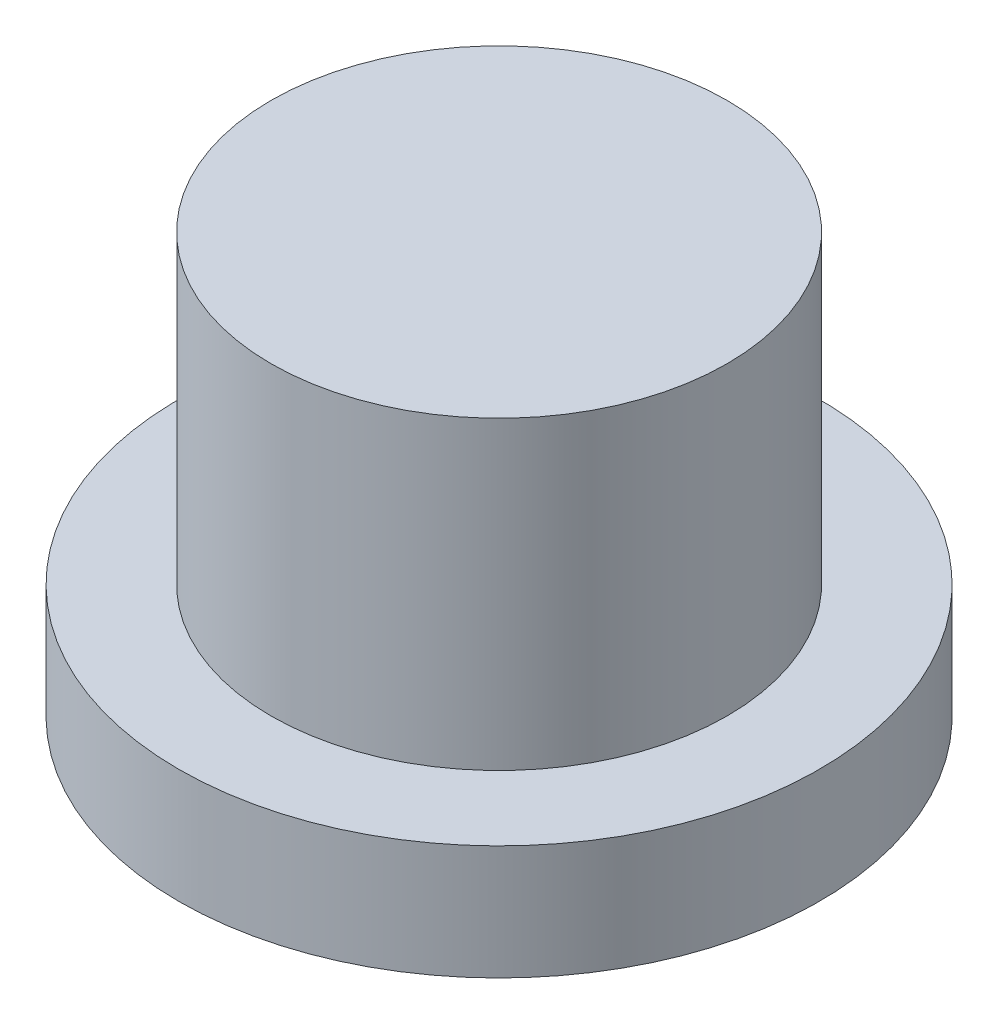
ISO-10303-21;
HEADER;
FILE_DESCRIPTION(('STEP AP214'),'2;1');
FILE_NAME('part.step','',(''),(''),'','','');
FILE_SCHEMA(('AUTOMOTIVE_DESIGN { 1 0 10303 214 1 1 1 1 }'));
ENDSEC;
DATA;
#1=APPLICATION_CONTEXT('core data for automotive mechanical design processes');
#2=APPLICATION_PROTOCOL_DEFINITION('international standard','automotive_design',2000,#1);
#3=PRODUCT_CONTEXT('',#1,'mechanical');
#4=PRODUCT('Part','Part','',(#3));
#5=PRODUCT_RELATED_PRODUCT_CATEGORY('part','',(#4));
#6=PRODUCT_DEFINITION_FORMATION('','',#4);
#7=PRODUCT_DEFINITION_CONTEXT('part definition',#1,'design');
#8=PRODUCT_DEFINITION('design','',#6,#7);
#9=PRODUCT_DEFINITION_SHAPE('','',#8);
#10=(LENGTH_UNIT() NAMED_UNIT(*) SI_UNIT(.MILLI.,.METRE.));
#11=(NAMED_UNIT(*) PLANE_ANGLE_UNIT() SI_UNIT($,.RADIAN.));
#12=(NAMED_UNIT(*) SI_UNIT($,.STERADIAN.) SOLID_ANGLE_UNIT());
#13=UNCERTAINTY_MEASURE_WITH_UNIT(LENGTH_MEASURE(1.E-05),#10,'distance_accuracy_value','');
#14=(GEOMETRIC_REPRESENTATION_CONTEXT(3) GLOBAL_UNCERTAINTY_ASSIGNED_CONTEXT((#13)) GLOBAL_UNIT_ASSIGNED_CONTEXT((#10,
#11,#12)) REPRESENTATION_CONTEXT('',''));
#15=CARTESIAN_POINT('',(0.,0.,0.));
#16=DIRECTION('',(0.,0.,1.));
#17=DIRECTION('',(1.,0.,0.));
#18=AXIS2_PLACEMENT_3D('',#15,#16,#17);
#19=CARTESIAN_POINT('',(0.,7.5,0.));
#20=DIRECTION('',(0.,-1.,0.));
#21=DIRECTION('',(0.,0.,-1.));
#22=AXIS2_PLACEMENT_3D('',#19,#20,#21);
#23=CYLINDRICAL_SURFACE('',#22,21.);
#24=CARTESIAN_POINT('',(0.,7.5,0.));
#25=DIRECTION('',(0.,1.,0.));
#26=DIRECTION('',(0.,0.,1.));
#27=AXIS2_PLACEMENT_3D('',#24,#25,#26);
#28=CIRCLE('',#27,21.);
#29=CARTESIAN_POINT('',(0.,7.5,21.));
#30=VERTEX_POINT('',#29);
#31=EDGE_CURVE('E356',#30,#30,#28,.T.);
#32=ORIENTED_EDGE('',*,*,#31,.F.);
#33=EDGE_LOOP('',(#32));
#34=FACE_BOUND('',#33,.T.);
#35=CARTESIAN_POINT('',(0.,0.,0.));
#36=DIRECTION('',(0.,1.,0.));
#37=DIRECTION('',(0.,0.,1.));
#38=AXIS2_PLACEMENT_3D('',#35,#36,#37);
#39=CIRCLE('',#38,21.);
#40=CARTESIAN_POINT('',(0.,0.,21.));
#41=VERTEX_POINT('',#40);
#42=EDGE_CURVE('E351',#41,#41,#39,.T.);
#43=ORIENTED_EDGE('',*,*,#42,.T.);
#44=EDGE_LOOP('',(#43));
#45=FACE_BOUND('',#44,.T.);
#46=ADVANCED_FACE('F39',(#34,#45),#23,.T.);
#47=CARTESIAN_POINT('',(0.,7.5,0.));
#48=DIRECTION('',(0.,1.,0.));
#49=DIRECTION('',(0.,0.,1.));
#50=AXIS2_PLACEMENT_3D('',#47,#48,#49);
#51=PLANE('',#50);
#52=CARTESIAN_POINT('',(0.,7.5,0.));
#53=DIRECTION('',(0.,1.,0.));
#54=DIRECTION('',(0.,0.,1.));
#55=AXIS2_PLACEMENT_3D('',#52,#53,#54);
#56=CIRCLE('',#55,14.95);
#57=CARTESIAN_POINT('',(0.,7.5,14.95));
#58=VERTEX_POINT('',#57);
#59=EDGE_CURVE('E352',#58,#58,#56,.T.);
#60=ORIENTED_EDGE('',*,*,#59,.F.);
#61=EDGE_LOOP('',(#60));
#62=FACE_BOUND('',#61,.T.);
#63=ORIENTED_EDGE('',*,*,#31,.T.);
#64=EDGE_LOOP('',(#63));
#65=FACE_BOUND('',#64,.T.);
#66=ADVANCED_FACE('F502',(#62,#65),#51,.T.);
#67=CARTESIAN_POINT('',(0.,0.,0.));
#68=DIRECTION('',(0.,1.,0.));
#69=DIRECTION('',(0.,0.,1.));
#70=AXIS2_PLACEMENT_3D('',#67,#68,#69);
#71=PLANE('',#70);
#72=DIRECTION('',(-0.116826282110367,0.,0.993152364850565));
#73=VECTOR('',#72,1.);
#74=CARTESIAN_POINT('',(-3.18578214012003,0.,-8.86814948593806));
#75=LINE('',#74,#73);
#76=CARTESIAN_POINT('',(-3.18578214012002,0.,-8.86814948593809));
#77=VERTEX_POINT('',#76);
#78=CARTESIAN_POINT('',(-3.52869538076535,0.,-5.95300839154165));
#79=VERTEX_POINT('',#78);
#80=EDGE_CURVE('E355',#77,#79,#75,.T.);
#81=ORIENTED_EDGE('',*,*,#80,.T.);
#82=CARTESIAN_POINT('',(-4.81979345507109,0.,-6.10488255828512));
#83=DIRECTION('',(0.,-1.,0.));
#84=DIRECTION('',(0.,0.,-1.));
#85=AXIS2_PLACEMENT_3D('',#82,#83,#84);
#86=CIRCLE('',#85,1.3);
#87=CARTESIAN_POINT('',(-4.97166762181456,0.,-4.81378448397939));
#88=VERTEX_POINT('',#87);
#89=EDGE_CURVE('E11',#79,#88,#86,.T.);
#90=ORIENTED_EDGE('',*,*,#89,.T.);
#91=DIRECTION('',(-0.993152364850565,0.,-0.116826282110367));
#92=VECTOR('',#91,1.);
#93=CARTESIAN_POINT('',(-4.97166762181457,0.,-4.81378448397939));
#94=LINE('',#93,#92);
#95=CARTESIAN_POINT('',(-7.88680871621093,0.,-5.15669772462471));
#96=VERTEX_POINT('',#95);
#97=EDGE_CURVE('E48',#88,#96,#94,.T.);
#98=ORIENTED_EDGE('',*,*,#97,.T.);
#99=DIRECTION('',(-0.999069947267007,0.,0.0431189107921244));
#100=VECTOR('',#99,1.);
#101=CARTESIAN_POINT('',(-7.88680871621095,0.,-5.15669772462471));
#102=LINE('',#101,#100);
#103=CARTESIAN_POINT('',(-17.4965874440236,0.,-4.74194879455218));
#104=VERTEX_POINT('',#103);
#105=EDGE_CURVE('E422',#96,#104,#102,.T.);
#106=ORIENTED_EDGE('',*,*,#105,.T.);
#107=CARTESIAN_POINT('',(-17.3801663848849,0.,-2.04445993693142));
#108=DIRECTION('',(0.,-1.,0.));
#109=DIRECTION('',(0.,0.,-1.));
#110=AXIS2_PLACEMENT_3D('',#107,#108,#109);
#111=CIRCLE('',#110,2.69999999999985);
#112=CARTESIAN_POINT('',(-18.1193688202738,0.,0.552380404621027));
#113=VERTEX_POINT('',#112);
#114=EDGE_CURVE('E419',#104,#113,#111,.F.);
#115=ORIENTED_EDGE('',*,*,#114,.T.);
#116=DIRECTION('',(0.961792719093556,0.,0.273778679773688));
#117=VECTOR('',#116,1.);
#118=CARTESIAN_POINT('',(-18.1193688202739,0.,0.552380404621015));
#119=LINE('',#118,#117);
#120=CARTESIAN_POINT('',(-8.86814948593807,0.,3.18578214012002));
#121=VERTEX_POINT('',#120);
#122=EDGE_CURVE('E416',#113,#121,#119,.T.);
#123=ORIENTED_EDGE('',*,*,#122,.T.);
#124=DIRECTION('',(0.993152364850565,0.,0.116826282110367));
#125=VECTOR('',#124,1.);
#126=CARTESIAN_POINT('',(-8.86814948593805,0.,3.18578214012003));
#127=LINE('',#126,#125);
#128=CARTESIAN_POINT('',(-5.95300839154165,0.,3.52869538076535));
#129=VERTEX_POINT('',#128);
#130=EDGE_CURVE('E413',#121,#129,#127,.T.);
#131=ORIENTED_EDGE('',*,*,#130,.T.);
#132=CARTESIAN_POINT('',(-6.10488255828512,0.,4.81979345507109));
#133=DIRECTION('',(0.,-1.,0.));
#134=DIRECTION('',(0.,0.,-1.));
#135=AXIS2_PLACEMENT_3D('',#132,#133,#134);
#136=CIRCLE('',#135,1.3);
#137=CARTESIAN_POINT('',(-4.81378448397939,0.,4.97166762181456));
#138=VERTEX_POINT('',#137);
#139=EDGE_CURVE('E410',#129,#138,#136,.T.);
#140=ORIENTED_EDGE('',*,*,#139,.T.);
#141=DIRECTION('',(-0.116826282110367,0.,0.993152364850565));
#142=VECTOR('',#141,1.);
#143=CARTESIAN_POINT('',(-4.81378448397939,0.,4.97166762181457));
#144=LINE('',#143,#142);
#145=CARTESIAN_POINT('',(-5.15669772462471,0.,7.88680871621093));
#146=VERTEX_POINT('',#145);
#147=EDGE_CURVE('E407',#138,#146,#144,.T.);
#148=ORIENTED_EDGE('',*,*,#147,.T.);
#149=DIRECTION('',(0.0431189107921244,0.,0.999069947267007));
#150=VECTOR('',#149,1.);
#151=CARTESIAN_POINT('',(-5.15669772462471,0.,7.88680871621095));
#152=LINE('',#151,#150);
#153=CARTESIAN_POINT('',(-4.74194879455218,0.,17.4965874440236));
#154=VERTEX_POINT('',#153);
#155=EDGE_CURVE('E404',#146,#154,#152,.T.);
#156=ORIENTED_EDGE('',*,*,#155,.T.);
#157=CARTESIAN_POINT('',(-2.04445993693141,0.,17.3801663848849));
#158=DIRECTION('',(0.,-1.,0.));
#159=DIRECTION('',(0.,0.,-1.));
#160=AXIS2_PLACEMENT_3D('',#157,#158,#159);
#161=CIRCLE('',#160,2.69999999999985);
#162=CARTESIAN_POINT('',(0.552380404621032,0.,18.1193688202738));
#163=VERTEX_POINT('',#162);
#164=EDGE_CURVE('E401',#154,#163,#161,.F.);
#165=ORIENTED_EDGE('',*,*,#164,.T.);
#166=DIRECTION('',(0.273778679773688,0.,-0.961792719093556));
#167=VECTOR('',#166,1.);
#168=CARTESIAN_POINT('',(0.552380404621017,0.,18.1193688202739));
#169=LINE('',#168,#167);
#170=CARTESIAN_POINT('',(3.18578214012003,0.,8.86814948593804));
#171=VERTEX_POINT('',#170);
#172=EDGE_CURVE('E398',#163,#171,#169,.T.);
#173=ORIENTED_EDGE('',*,*,#172,.T.);
#174=DIRECTION('',(0.116826282110367,0.,-0.993152364850565));
#175=VECTOR('',#174,1.);
#176=CARTESIAN_POINT('',(3.18578214012003,0.,8.86814948593805));
#177=LINE('',#176,#175);
#178=CARTESIAN_POINT('',(3.52869538076535,0.,5.95300839154165));
#179=VERTEX_POINT('',#178);
#180=EDGE_CURVE('E395',#171,#179,#177,.T.);
#181=ORIENTED_EDGE('',*,*,#180,.T.);
#182=CARTESIAN_POINT('',(4.81979345507109,0.,6.10488255828512));
#183=DIRECTION('',(0.,-1.,0.));
#184=DIRECTION('',(0.,0.,-1.));
#185=AXIS2_PLACEMENT_3D('',#182,#183,#184);
#186=CIRCLE('',#185,1.3);
#187=CARTESIAN_POINT('',(4.97166762181456,0.,4.81378448397939));
#188=VERTEX_POINT('',#187);
#189=EDGE_CURVE('E392',#179,#188,#186,.T.);
#190=ORIENTED_EDGE('',*,*,#189,.T.);
#191=DIRECTION('',(0.993152364850565,0.,0.116826282110367));
#192=VECTOR('',#191,1.);
#193=CARTESIAN_POINT('',(4.97166762181457,0.,4.81378448397939));
#194=LINE('',#193,#192);
#195=CARTESIAN_POINT('',(7.88680871621094,0.,5.15669772462471));
#196=VERTEX_POINT('',#195);
#197=EDGE_CURVE('E389',#188,#196,#194,.T.);
#198=ORIENTED_EDGE('',*,*,#197,.T.);
#199=DIRECTION('',(0.999069947267003,0.,-0.043118910792224));
#200=VECTOR('',#199,1.);
#201=CARTESIAN_POINT('',(7.88680871621093,0.,5.15669772462472));
#202=LINE('',#201,#200);
#203=CARTESIAN_POINT('',(17.4965874440208,0.,4.74194879455135));
#204=VERTEX_POINT('',#203);
#205=EDGE_CURVE('E386',#196,#204,#202,.T.);
#206=ORIENTED_EDGE('',*,*,#205,.T.);
#207=CARTESIAN_POINT('',(17.3801663848849,0.,2.04445993693142));
#208=DIRECTION('',(0.,-1.,0.));
#209=DIRECTION('',(0.,0.,-1.));
#210=AXIS2_PLACEMENT_3D('',#207,#208,#209);
#211=CIRCLE('',#210,2.69999999999889);
#212=CARTESIAN_POINT('',(18.1193688202706,0.,-0.552380404620947));
#213=VERTEX_POINT('',#212);
#214=EDGE_CURVE('E383',#204,#213,#211,.F.);
#215=ORIENTED_EDGE('',*,*,#214,.T.);
#216=DIRECTION('',(-0.961792719093529,0.,-0.273778679773784));
#217=VECTOR('',#216,1.);
#218=CARTESIAN_POINT('',(18.1193688202738,0.,-0.552380404620042));
#219=LINE('',#218,#217);
#220=CARTESIAN_POINT('',(8.86814948593808,0.,-3.18578214012002));
#221=VERTEX_POINT('',#220);
#222=EDGE_CURVE('E380',#213,#221,#219,.T.);
#223=ORIENTED_EDGE('',*,*,#222,.T.);
#224=DIRECTION('',(-0.993152364850565,0.,-0.116826282110367));
#225=VECTOR('',#224,1.);
#226=CARTESIAN_POINT('',(8.86814948593805,0.,-3.18578214012003));
#227=LINE('',#226,#225);
#228=CARTESIAN_POINT('',(5.95300839154165,0.,-3.52869538076535));
#229=VERTEX_POINT('',#228);
#230=EDGE_CURVE('E377',#221,#229,#227,.T.);
#231=ORIENTED_EDGE('',*,*,#230,.T.);
#232=CARTESIAN_POINT('',(6.10488255828512,0.,-4.81979345507109));
#233=DIRECTION('',(0.,-1.,0.));
#234=DIRECTION('',(0.,0.,-1.));
#235=AXIS2_PLACEMENT_3D('',#232,#233,#234);
#236=CIRCLE('',#235,1.3);
#237=CARTESIAN_POINT('',(4.81378448397939,0.,-4.97166762181456));
#238=VERTEX_POINT('',#237);
#239=EDGE_CURVE('E374',#229,#238,#236,.T.);
#240=ORIENTED_EDGE('',*,*,#239,.T.);
#241=DIRECTION('',(0.116826282110365,0.,-0.993152364850565));
#242=VECTOR('',#241,1.);
#243=CARTESIAN_POINT('',(4.81378448397939,0.,-4.97166762181456));
#244=LINE('',#243,#242);
#245=CARTESIAN_POINT('',(5.15669772462466,0.,-7.88680871621051));
#246=VERTEX_POINT('',#245);
#247=EDGE_CURVE('E371',#238,#246,#244,.T.);
#248=ORIENTED_EDGE('',*,*,#247,.T.);
#249=DIRECTION('',(-0.0431189107922163,0.,-0.999069947267003));
#250=VECTOR('',#249,1.);
#251=CARTESIAN_POINT('',(5.15669772462466,0.,-7.88680871621052));
#252=LINE('',#251,#250);
#253=CARTESIAN_POINT('',(4.74194879455135,0.,-17.4965874440208));
#254=VERTEX_POINT('',#253);
#255=EDGE_CURVE('E368',#246,#254,#252,.T.);
#256=ORIENTED_EDGE('',*,*,#255,.T.);
#257=CARTESIAN_POINT('',(2.04445993693142,0.,-17.3801663848849));
#258=DIRECTION('',(0.,-1.,0.));
#259=DIRECTION('',(0.,0.,-1.));
#260=AXIS2_PLACEMENT_3D('',#257,#258,#259);
#261=CIRCLE('',#260,2.69999999999889);
#262=CARTESIAN_POINT('',(-0.552380404620939,0.,-18.1193688202706));
#263=VERTEX_POINT('',#262);
#264=EDGE_CURVE('E365',#254,#263,#261,.F.);
#265=ORIENTED_EDGE('',*,*,#264,.T.);
#266=DIRECTION('',(-0.273778679773785,0.,0.961792719093529));
#267=VECTOR('',#266,1.);
#268=CARTESIAN_POINT('',(-0.552380404620035,0.,-18.1193688202738));
#269=LINE('',#268,#267);
#270=EDGE_CURVE('E362',#263,#77,#269,.T.);
#271=ORIENTED_EDGE('',*,*,#270,.T.);
#272=EDGE_LOOP('',(#81,#90,#98,#106,#115,#123,#131,#140,#148,#156,#165,#173,#181,#190,#198,#206,
#215,#223,#231,#240,#248,#256,#265,#271));
#273=FACE_BOUND('',#272,.T.);
#274=ORIENTED_EDGE('',*,*,#42,.F.);
#275=EDGE_LOOP('',(#274));
#276=FACE_BOUND('',#275,.T.);
#277=ADVANCED_FACE('F427',(#273,#276),#71,.F.);
#278=CARTESIAN_POINT('',(0.,27.5,0.));
#279=DIRECTION('',(0.,-1.,0.));
#280=DIRECTION('',(0.,0.,-1.));
#281=AXIS2_PLACEMENT_3D('',#278,#279,#280);
#282=CYLINDRICAL_SURFACE('',#281,14.95);
#283=CARTESIAN_POINT('',(0.,27.5,0.));
#284=DIRECTION('',(0.,1.,0.));
#285=DIRECTION('',(0.,0.,1.));
#286=AXIS2_PLACEMENT_3D('',#283,#284,#285);
#287=CIRCLE('',#286,14.95);
#288=CARTESIAN_POINT('',(0.,27.5,14.95));
#289=VERTEX_POINT('',#288);
#290=EDGE_CURVE('E289',#289,#289,#287,.T.);
#291=ORIENTED_EDGE('',*,*,#290,.F.);
#292=EDGE_LOOP('',(#291));
#293=FACE_BOUND('',#292,.T.);
#294=ORIENTED_EDGE('',*,*,#59,.T.);
#295=EDGE_LOOP('',(#294));
#296=FACE_BOUND('',#295,.T.);
#297=ADVANCED_FACE('F513',(#293,#296),#282,.T.);
#298=CARTESIAN_POINT('',(0.,27.5,0.));
#299=DIRECTION('',(0.,1.,0.));
#300=DIRECTION('',(0.,0.,1.));
#301=AXIS2_PLACEMENT_3D('',#298,#299,#300);
#302=PLANE('',#301);
#303=ORIENTED_EDGE('',*,*,#290,.T.);
#304=EDGE_LOOP('',(#303));
#305=FACE_BOUND('',#304,.T.);
#306=ADVANCED_FACE('F519',(#305),#302,.T.);
#307=CARTESIAN_POINT('',(-4.81979345507109,2.5,-6.10488255828512));
#308=DIRECTION('',(0.,-1.,0.));
#309=DIRECTION('',(0.,0.,-1.));
#310=AXIS2_PLACEMENT_3D('',#307,#308,#309);
#311=CYLINDRICAL_SURFACE('',#310,1.3);
#312=DIRECTION('',(0.,-1.,0.));
#313=VECTOR('',#312,1.);
#314=CARTESIAN_POINT('',(-3.52869538076535,2.5,-5.95300839154165));
#315=LINE('',#314,#313);
#316=CARTESIAN_POINT('',(-3.52869538076535,2.5,-5.95300839154165));
#317=VERTEX_POINT('',#316);
#318=EDGE_CURVE('E54',#317,#79,#315,.T.);
#319=ORIENTED_EDGE('',*,*,#318,.F.);
#320=CARTESIAN_POINT('',(-4.81979345507109,2.5,-6.10488255828512));
#321=DIRECTION('',(0.,1.,0.));
#322=DIRECTION('',(0.,0.,-1.));
#323=AXIS2_PLACEMENT_3D('',#320,#321,#322);
#324=CIRCLE('',#323,1.3);
#325=CARTESIAN_POINT('',(-4.97166762181456,2.5,-4.81378448397939));
#326=VERTEX_POINT('',#325);
#327=EDGE_CURVE('E198',#326,#317,#324,.T.);
#328=ORIENTED_EDGE('',*,*,#327,.F.);
#329=DIRECTION('',(0.,-1.,0.));
#330=VECTOR('',#329,1.);
#331=CARTESIAN_POINT('',(-4.97166762181456,2.5,-4.81378448397939));
#332=LINE('',#331,#330);
#333=EDGE_CURVE('E287',#326,#88,#332,.T.);
#334=ORIENTED_EDGE('',*,*,#333,.T.);
#335=ORIENTED_EDGE('',*,*,#89,.F.);
#336=EDGE_LOOP('',(#319,#328,#334,#335));
#337=FACE_BOUND('',#336,.T.);
#338=ADVANCED_FACE('F195',(#337),#311,.T.);
#339=CARTESIAN_POINT('',(-4.97166762181456,2.5,-4.81378448397939));
#340=DIRECTION('',(0.116826282110367,0.,-0.993152364850565));
#341=DIRECTION('',(-0.993152364850565,0.,-0.116826282110367));
#342=AXIS2_PLACEMENT_3D('',#339,#340,#341);
#343=PLANE('',#342);
#344=ORIENTED_EDGE('',*,*,#333,.F.);
#345=DIRECTION('',(0.993152364850565,0.,0.116826282110367));
#346=VECTOR('',#345,1.);
#347=CARTESIAN_POINT('',(-4.97166762181456,2.5,-4.81378448397939));
#348=LINE('',#347,#346);
#349=CARTESIAN_POINT('',(-7.88680871621095,2.5,-5.15669772462471));
#350=VERTEX_POINT('',#349);
#351=EDGE_CURVE('E202',#350,#326,#348,.T.);
#352=ORIENTED_EDGE('',*,*,#351,.F.);
#353=DIRECTION('',(0.,-1.,0.));
#354=VECTOR('',#353,1.);
#355=CARTESIAN_POINT('',(-7.88680871621095,2.5,-5.15669772462471));
#356=LINE('',#355,#354);
#357=EDGE_CURVE('E290',#350,#96,#356,.T.);
#358=ORIENTED_EDGE('',*,*,#357,.T.);
#359=ORIENTED_EDGE('',*,*,#97,.F.);
#360=EDGE_LOOP('',(#344,#352,#358,#359));
#361=FACE_BOUND('',#360,.T.);
#362=ADVANCED_FACE('F430',(#361),#343,.F.);
#363=CARTESIAN_POINT('',(-7.88680871621095,2.5,-5.15669772462471));
#364=DIRECTION('',(-0.0431189107921244,0.,-0.999069947267007));
#365=DIRECTION('',(-0.999069947267007,0.,0.0431189107921244));
#366=AXIS2_PLACEMENT_3D('',#363,#364,#365);
#367=PLANE('',#366);
#368=ORIENTED_EDGE('',*,*,#357,.F.);
#369=DIRECTION('',(0.999069947267007,0.,-0.0431189107921244));
#370=VECTOR('',#369,1.);
#371=CARTESIAN_POINT('',(-7.88680871621095,2.5,-5.15669772462471));
#372=LINE('',#371,#370);
#373=CARTESIAN_POINT('',(-17.4965874440237,2.5,-4.74194879455218));
#374=VERTEX_POINT('',#373);
#375=EDGE_CURVE('E279',#374,#350,#372,.T.);
#376=ORIENTED_EDGE('',*,*,#375,.F.);
#377=DIRECTION('',(0.,-1.,0.));
#378=VECTOR('',#377,1.);
#379=CARTESIAN_POINT('',(-17.4965874440237,2.5,-4.74194879455218));
#380=LINE('',#379,#378);
#381=EDGE_CURVE('E344',#374,#104,#380,.T.);
#382=ORIENTED_EDGE('',*,*,#381,.T.);
#383=ORIENTED_EDGE('',*,*,#105,.F.);
#384=EDGE_LOOP('',(#368,#376,#382,#383));
#385=FACE_BOUND('',#384,.T.);
#386=ADVANCED_FACE('F433',(#385),#367,.F.);
#387=CARTESIAN_POINT('',(-17.3801663848849,2.5,-2.04445993693142));
#388=DIRECTION('',(0.,-1.,0.));
#389=DIRECTION('',(0.,0.,-1.));
#390=AXIS2_PLACEMENT_3D('',#387,#388,#389);
#391=CYLINDRICAL_SURFACE('',#390,2.69999999999985);
#392=ORIENTED_EDGE('',*,*,#381,.F.);
#393=CARTESIAN_POINT('',(-17.3801663848849,2.5,-2.04445993693142));
#394=DIRECTION('',(0.,-1.,0.));
#395=DIRECTION('',(0.,0.,-1.));
#396=AXIS2_PLACEMENT_3D('',#393,#394,#395);
#397=CIRCLE('',#396,2.69999999999985);
#398=CARTESIAN_POINT('',(-18.1193688202739,2.5,0.552380404621018));
#399=VERTEX_POINT('',#398);
#400=EDGE_CURVE('E276',#399,#374,#397,.T.);
#401=ORIENTED_EDGE('',*,*,#400,.F.);
#402=DIRECTION('',(0.,-1.,0.));
#403=VECTOR('',#402,1.);
#404=CARTESIAN_POINT('',(-18.1193688202739,2.5,0.552380404621018));
#405=LINE('',#404,#403);
#406=EDGE_CURVE('E341',#399,#113,#405,.T.);
#407=ORIENTED_EDGE('',*,*,#406,.T.);
#408=ORIENTED_EDGE('',*,*,#114,.F.);
#409=EDGE_LOOP('',(#392,#401,#407,#408));
#410=FACE_BOUND('',#409,.T.);
#411=ADVANCED_FACE('F437',(#410),#391,.F.);
#412=CARTESIAN_POINT('',(-8.86814948593803,2.5,3.18578214012003));
#413=DIRECTION('',(-0.273778679773688,0.,0.961792719093556));
#414=DIRECTION('',(0.961792719093556,0.,0.273778679773688));
#415=AXIS2_PLACEMENT_3D('',#412,#413,#414);
#416=PLANE('',#415);
#417=ORIENTED_EDGE('',*,*,#406,.F.);
#418=DIRECTION('',(-0.961792719093556,0.,-0.273778679773688));
#419=VECTOR('',#418,1.);
#420=CARTESIAN_POINT('',(-8.86814948593803,2.5,3.18578214012003));
#421=LINE('',#420,#419);
#422=CARTESIAN_POINT('',(-8.86814948593803,2.5,3.18578214012003));
#423=VERTEX_POINT('',#422);
#424=EDGE_CURVE('E273',#423,#399,#421,.T.);
#425=ORIENTED_EDGE('',*,*,#424,.F.);
#426=DIRECTION('',(0.,-1.,0.));
#427=VECTOR('',#426,1.);
#428=CARTESIAN_POINT('',(-8.86814948593803,2.5,3.18578214012003));
#429=LINE('',#428,#427);
#430=EDGE_CURVE('E338',#423,#121,#429,.T.);
#431=ORIENTED_EDGE('',*,*,#430,.T.);
#432=ORIENTED_EDGE('',*,*,#122,.F.);
#433=EDGE_LOOP('',(#417,#425,#431,#432));
#434=FACE_BOUND('',#433,.T.);
#435=ADVANCED_FACE('F439',(#434),#416,.F.);
#436=CARTESIAN_POINT('',(-5.95300839154165,2.5,3.52869538076535));
#437=DIRECTION('',(-0.116826282110367,0.,0.993152364850565));
#438=DIRECTION('',(0.993152364850565,0.,0.116826282110367));
#439=AXIS2_PLACEMENT_3D('',#436,#437,#438);
#440=PLANE('',#439);
#441=ORIENTED_EDGE('',*,*,#430,.F.);
#442=DIRECTION('',(-0.993152364850565,0.,-0.116826282110367));
#443=VECTOR('',#442,1.);
#444=CARTESIAN_POINT('',(-5.95300839154165,2.5,3.52869538076535));
#445=LINE('',#444,#443);
#446=CARTESIAN_POINT('',(-5.95300839154165,2.5,3.52869538076535));
#447=VERTEX_POINT('',#446);
#448=EDGE_CURVE('E270',#447,#423,#445,.T.);
#449=ORIENTED_EDGE('',*,*,#448,.F.);
#450=DIRECTION('',(0.,-1.,0.));
#451=VECTOR('',#450,1.);
#452=CARTESIAN_POINT('',(-5.95300839154165,2.5,3.52869538076535));
#453=LINE('',#452,#451);
#454=EDGE_CURVE('E335',#447,#129,#453,.T.);
#455=ORIENTED_EDGE('',*,*,#454,.T.);
#456=ORIENTED_EDGE('',*,*,#130,.F.);
#457=EDGE_LOOP('',(#441,#449,#455,#456));
#458=FACE_BOUND('',#457,.T.);
#459=ADVANCED_FACE('F442',(#458),#440,.F.);
#460=CARTESIAN_POINT('',(-6.10488255828512,2.5,4.81979345507109));
#461=DIRECTION('',(0.,-1.,0.));
#462=DIRECTION('',(0.,0.,-1.));
#463=AXIS2_PLACEMENT_3D('',#460,#461,#462);
#464=CYLINDRICAL_SURFACE('',#463,1.3);
#465=ORIENTED_EDGE('',*,*,#454,.F.);
#466=CARTESIAN_POINT('',(-6.10488255828512,2.5,4.81979345507109));
#467=DIRECTION('',(0.,1.,0.));
#468=DIRECTION('',(0.,0.,-1.));
#469=AXIS2_PLACEMENT_3D('',#466,#467,#468);
#470=CIRCLE('',#469,1.3);
#471=CARTESIAN_POINT('',(-4.81378448397939,2.5,4.97166762181456));
#472=VERTEX_POINT('',#471);
#473=EDGE_CURVE('E267',#472,#447,#470,.T.);
#474=ORIENTED_EDGE('',*,*,#473,.F.);
#475=DIRECTION('',(0.,-1.,0.));
#476=VECTOR('',#475,1.);
#477=CARTESIAN_POINT('',(-4.81378448397939,2.5,4.97166762181456));
#478=LINE('',#477,#476);
#479=EDGE_CURVE('E332',#472,#138,#478,.T.);
#480=ORIENTED_EDGE('',*,*,#479,.T.);
#481=ORIENTED_EDGE('',*,*,#139,.F.);
#482=EDGE_LOOP('',(#465,#474,#480,#481));
#483=FACE_BOUND('',#482,.T.);
#484=ADVANCED_FACE('F445',(#483),#464,.T.);
#485=CARTESIAN_POINT('',(-4.81378448397939,2.5,4.97166762181456));
#486=DIRECTION('',(-0.993152364850565,0.,-0.116826282110367));
#487=DIRECTION('',(-0.116826282110367,0.,0.993152364850565));
#488=AXIS2_PLACEMENT_3D('',#485,#486,#487);
#489=PLANE('',#488);
#490=ORIENTED_EDGE('',*,*,#479,.F.);
#491=DIRECTION('',(0.116826282110367,0.,-0.993152364850565));
#492=VECTOR('',#491,1.);
#493=CARTESIAN_POINT('',(-4.81378448397939,2.5,4.97166762181456));
#494=LINE('',#493,#492);
#495=CARTESIAN_POINT('',(-5.15669772462471,2.5,7.88680871621095));
#496=VERTEX_POINT('',#495);
#497=EDGE_CURVE('E264',#496,#472,#494,.T.);
#498=ORIENTED_EDGE('',*,*,#497,.F.);
#499=DIRECTION('',(0.,-1.,0.));
#500=VECTOR('',#499,1.);
#501=CARTESIAN_POINT('',(-5.15669772462471,2.5,7.88680871621095));
#502=LINE('',#501,#500);
#503=EDGE_CURVE('E329',#496,#146,#502,.T.);
#504=ORIENTED_EDGE('',*,*,#503,.T.);
#505=ORIENTED_EDGE('',*,*,#147,.F.);
#506=EDGE_LOOP('',(#490,#498,#504,#505));
#507=FACE_BOUND('',#506,.T.);
#508=ADVANCED_FACE('F447',(#507),#489,.F.);
#509=CARTESIAN_POINT('',(-5.15669772462471,2.5,7.88680871621095));
#510=DIRECTION('',(-0.999069947267007,0.,0.0431189107921244));
#511=DIRECTION('',(0.0431189107921244,0.,0.999069947267007));
#512=AXIS2_PLACEMENT_3D('',#509,#510,#511);
#513=PLANE('',#512);
#514=ORIENTED_EDGE('',*,*,#503,.F.);
#515=DIRECTION('',(-0.0431189107921244,0.,-0.999069947267007));
#516=VECTOR('',#515,1.);
#517=CARTESIAN_POINT('',(-5.15669772462471,2.5,7.88680871621095));
#518=LINE('',#517,#516);
#519=CARTESIAN_POINT('',(-4.74194879455218,2.5,17.4965874440237));
#520=VERTEX_POINT('',#519);
#521=EDGE_CURVE('E261',#520,#496,#518,.T.);
#522=ORIENTED_EDGE('',*,*,#521,.F.);
#523=DIRECTION('',(0.,-1.,0.));
#524=VECTOR('',#523,1.);
#525=CARTESIAN_POINT('',(-4.74194879455218,2.5,17.4965874440237));
#526=LINE('',#525,#524);
#527=EDGE_CURVE('E326',#520,#154,#526,.T.);
#528=ORIENTED_EDGE('',*,*,#527,.T.);
#529=ORIENTED_EDGE('',*,*,#155,.F.);
#530=EDGE_LOOP('',(#514,#522,#528,#529));
#531=FACE_BOUND('',#530,.T.);
#532=ADVANCED_FACE('F451',(#531),#513,.F.);
#533=CARTESIAN_POINT('',(-2.04445993693141,2.5,17.3801663848849));
#534=DIRECTION('',(0.,-1.,0.));
#535=DIRECTION('',(0.,0.,-1.));
#536=AXIS2_PLACEMENT_3D('',#533,#534,#535);
#537=CYLINDRICAL_SURFACE('',#536,2.69999999999985);
#538=ORIENTED_EDGE('',*,*,#527,.F.);
#539=CARTESIAN_POINT('',(-2.04445993693141,2.5,17.3801663848849));
#540=DIRECTION('',(0.,-1.,0.));
#541=DIRECTION('',(0.,0.,-1.));
#542=AXIS2_PLACEMENT_3D('',#539,#540,#541);
#543=CIRCLE('',#542,2.69999999999985);
#544=CARTESIAN_POINT('',(0.552380404621023,2.5,18.1193688202739));
#545=VERTEX_POINT('',#544);
#546=EDGE_CURVE('E258',#545,#520,#543,.T.);
#547=ORIENTED_EDGE('',*,*,#546,.F.);
#548=DIRECTION('',(0.,-1.,0.));
#549=VECTOR('',#548,1.);
#550=CARTESIAN_POINT('',(0.552380404621023,2.5,18.1193688202739));
#551=LINE('',#550,#549);
#552=EDGE_CURVE('E323',#545,#163,#551,.T.);
#553=ORIENTED_EDGE('',*,*,#552,.T.);
#554=ORIENTED_EDGE('',*,*,#164,.F.);
#555=EDGE_LOOP('',(#538,#547,#553,#554));
#556=FACE_BOUND('',#555,.T.);
#557=ADVANCED_FACE('F454',(#556),#537,.F.);
#558=CARTESIAN_POINT('',(3.18578214012003,2.5,8.86814948593803));
#559=DIRECTION('',(0.961792719093556,0.,0.273778679773688));
#560=DIRECTION('',(0.273778679773688,0.,-0.961792719093556));
#561=AXIS2_PLACEMENT_3D('',#558,#559,#560);
#562=PLANE('',#561);
#563=ORIENTED_EDGE('',*,*,#552,.F.);
#564=DIRECTION('',(-0.273778679773688,0.,0.961792719093556));
#565=VECTOR('',#564,1.);
#566=CARTESIAN_POINT('',(3.18578214012003,2.5,8.86814948593803));
#567=LINE('',#566,#565);
#568=CARTESIAN_POINT('',(3.18578214012003,2.5,8.86814948593803));
#569=VERTEX_POINT('',#568);
#570=EDGE_CURVE('E255',#569,#545,#567,.T.);
#571=ORIENTED_EDGE('',*,*,#570,.F.);
#572=DIRECTION('',(0.,-1.,0.));
#573=VECTOR('',#572,1.);
#574=CARTESIAN_POINT('',(3.18578214012003,2.5,8.86814948593803));
#575=LINE('',#574,#573);
#576=EDGE_CURVE('E320',#569,#171,#575,.T.);
#577=ORIENTED_EDGE('',*,*,#576,.T.);
#578=ORIENTED_EDGE('',*,*,#172,.F.);
#579=EDGE_LOOP('',(#563,#571,#577,#578));
#580=FACE_BOUND('',#579,.T.);
#581=ADVANCED_FACE('F456',(#580),#562,.F.);
#582=CARTESIAN_POINT('',(3.52869538076535,2.5,5.95300839154165));
#583=DIRECTION('',(0.993152364850565,0.,0.116826282110367));
#584=DIRECTION('',(0.116826282110367,0.,-0.993152364850565));
#585=AXIS2_PLACEMENT_3D('',#582,#583,#584);
#586=PLANE('',#585);
#587=ORIENTED_EDGE('',*,*,#576,.F.);
#588=DIRECTION('',(-0.116826282110367,0.,0.993152364850565));
#589=VECTOR('',#588,1.);
#590=CARTESIAN_POINT('',(3.52869538076535,2.5,5.95300839154165));
#591=LINE('',#590,#589);
#592=CARTESIAN_POINT('',(3.52869538076535,2.5,5.95300839154165));
#593=VERTEX_POINT('',#592);
#594=EDGE_CURVE('E252',#593,#569,#591,.T.);
#595=ORIENTED_EDGE('',*,*,#594,.F.);
#596=DIRECTION('',(0.,-1.,0.));
#597=VECTOR('',#596,1.);
#598=CARTESIAN_POINT('',(3.52869538076535,2.5,5.95300839154165));
#599=LINE('',#598,#597);
#600=EDGE_CURVE('E317',#593,#179,#599,.T.);
#601=ORIENTED_EDGE('',*,*,#600,.T.);
#602=ORIENTED_EDGE('',*,*,#180,.F.);
#603=EDGE_LOOP('',(#587,#595,#601,#602));
#604=FACE_BOUND('',#603,.T.);
#605=ADVANCED_FACE('F460',(#604),#586,.F.);
#606=CARTESIAN_POINT('',(4.81979345507109,2.5,6.10488255828512));
#607=DIRECTION('',(0.,-1.,0.));
#608=DIRECTION('',(0.,0.,-1.));
#609=AXIS2_PLACEMENT_3D('',#606,#607,#608);
#610=CYLINDRICAL_SURFACE('',#609,1.3);
#611=ORIENTED_EDGE('',*,*,#600,.F.);
#612=CARTESIAN_POINT('',(4.81979345507109,2.5,6.10488255828512));
#613=DIRECTION('',(0.,1.,0.));
#614=DIRECTION('',(0.,0.,-1.));
#615=AXIS2_PLACEMENT_3D('',#612,#613,#614);
#616=CIRCLE('',#615,1.3);
#617=CARTESIAN_POINT('',(4.97166762181457,2.5,4.81378448397939));
#618=VERTEX_POINT('',#617);
#619=EDGE_CURVE('E249',#618,#593,#616,.T.);
#620=ORIENTED_EDGE('',*,*,#619,.F.);
#621=DIRECTION('',(0.,-1.,0.));
#622=VECTOR('',#621,1.);
#623=CARTESIAN_POINT('',(4.97166762181457,2.5,4.81378448397939));
#624=LINE('',#623,#622);
#625=EDGE_CURVE('E314',#618,#188,#624,.T.);
#626=ORIENTED_EDGE('',*,*,#625,.T.);
#627=ORIENTED_EDGE('',*,*,#189,.F.);
#628=EDGE_LOOP('',(#611,#620,#626,#627));
#629=FACE_BOUND('',#628,.T.);
#630=ADVANCED_FACE('F463',(#629),#610,.T.);
#631=CARTESIAN_POINT('',(4.97166762181457,2.5,4.81378448397939));
#632=DIRECTION('',(-0.116826282110367,0.,0.993152364850565));
#633=DIRECTION('',(0.993152364850565,0.,0.116826282110367));
#634=AXIS2_PLACEMENT_3D('',#631,#632,#633);
#635=PLANE('',#634);
#636=ORIENTED_EDGE('',*,*,#625,.F.);
#637=DIRECTION('',(-0.993152364850565,0.,-0.116826282110367));
#638=VECTOR('',#637,1.);
#639=CARTESIAN_POINT('',(4.97166762181457,2.5,4.81378448397939));
#640=LINE('',#639,#638);
#641=CARTESIAN_POINT('',(7.88680871621096,2.5,5.15669772462471));
#642=VERTEX_POINT('',#641);
#643=EDGE_CURVE('E246',#642,#618,#640,.T.);
#644=ORIENTED_EDGE('',*,*,#643,.F.);
#645=DIRECTION('',(0.,-1.,0.));
#646=VECTOR('',#645,1.);
#647=CARTESIAN_POINT('',(7.88680871621096,2.5,5.15669772462471));
#648=LINE('',#647,#646);
#649=EDGE_CURVE('E311',#642,#196,#648,.T.);
#650=ORIENTED_EDGE('',*,*,#649,.T.);
#651=ORIENTED_EDGE('',*,*,#197,.F.);
#652=EDGE_LOOP('',(#636,#644,#650,#651));
#653=FACE_BOUND('',#652,.T.);
#654=ADVANCED_FACE('F465',(#653),#635,.F.);
#655=CARTESIAN_POINT('',(7.88680871621096,2.5,5.15669772462471));
#656=DIRECTION('',(0.043118910792224,0.,0.999069947267003));
#657=DIRECTION('',(0.999069947267003,0.,-0.043118910792224));
#658=AXIS2_PLACEMENT_3D('',#655,#656,#657);
#659=PLANE('',#658);
#660=ORIENTED_EDGE('',*,*,#649,.F.);
#661=DIRECTION('',(-0.999069947267003,0.,0.043118910792224));
#662=VECTOR('',#661,1.);
#663=CARTESIAN_POINT('',(7.88680871621096,2.5,5.15669772462471));
#664=LINE('',#663,#662);
#665=CARTESIAN_POINT('',(17.4965874440177,2.5,4.74194879455148));
#666=VERTEX_POINT('',#665);
#667=EDGE_CURVE('E243',#666,#642,#664,.T.);
#668=ORIENTED_EDGE('',*,*,#667,.F.);
#669=DIRECTION('',(0.,-1.,0.));
#670=VECTOR('',#669,1.);
#671=CARTESIAN_POINT('',(17.4965874440177,2.5,4.74194879455148));
#672=LINE('',#671,#670);
#673=EDGE_CURVE('E308',#666,#204,#672,.T.);
#674=ORIENTED_EDGE('',*,*,#673,.T.);
#675=ORIENTED_EDGE('',*,*,#205,.F.);
#676=EDGE_LOOP('',(#660,#668,#674,#675));
#677=FACE_BOUND('',#676,.T.);
#678=ADVANCED_FACE('F469',(#677),#659,.F.);
#679=CARTESIAN_POINT('',(17.3801663848849,2.5,2.04445993693142));
#680=DIRECTION('',(0.,-1.,0.));
#681=DIRECTION('',(0.,0.,-1.));
#682=AXIS2_PLACEMENT_3D('',#679,#680,#681);
#683=CYLINDRICAL_SURFACE('',#682,2.69999999999889);
#684=ORIENTED_EDGE('',*,*,#673,.F.);
#685=CARTESIAN_POINT('',(17.3801663848849,2.5,2.04445993693142));
#686=DIRECTION('',(0.,-1.,0.));
#687=DIRECTION('',(0.,0.,-1.));
#688=AXIS2_PLACEMENT_3D('',#685,#686,#687);
#689=CIRCLE('',#688,2.69999999999889);
#690=CARTESIAN_POINT('',(18.1193688202674,2.5,-0.552380404621852));
#691=VERTEX_POINT('',#690);
#692=EDGE_CURVE('E240',#691,#666,#689,.T.);
#693=ORIENTED_EDGE('',*,*,#692,.F.);
#694=DIRECTION('',(0.,-1.,0.));
#695=VECTOR('',#694,1.);
#696=CARTESIAN_POINT('',(18.1193688202674,2.5,-0.552380404621852));
#697=LINE('',#696,#695);
#698=EDGE_CURVE('E305',#691,#213,#697,.T.);
#699=ORIENTED_EDGE('',*,*,#698,.T.);
#700=ORIENTED_EDGE('',*,*,#214,.F.);
#701=EDGE_LOOP('',(#684,#693,#699,#700));
#702=FACE_BOUND('',#701,.T.);
#703=ADVANCED_FACE('F472',(#702),#683,.F.);
#704=CARTESIAN_POINT('',(8.86814948593804,2.5,-3.18578214012003));
#705=DIRECTION('',(0.273778679773784,0.,-0.961792719093529));
#706=DIRECTION('',(-0.961792719093529,0.,-0.273778679773784));
#707=AXIS2_PLACEMENT_3D('',#704,#705,#706);
#708=PLANE('',#707);
#709=ORIENTED_EDGE('',*,*,#698,.F.);
#710=DIRECTION('',(0.961792719093529,0.,0.273778679773784));
#711=VECTOR('',#710,1.);
#712=CARTESIAN_POINT('',(8.86814948593804,2.5,-3.18578214012003));
#713=LINE('',#712,#711);
#714=CARTESIAN_POINT('',(8.86814948593804,2.5,-3.18578214012003));
#715=VERTEX_POINT('',#714);
#716=EDGE_CURVE('E237',#715,#691,#713,.T.);
#717=ORIENTED_EDGE('',*,*,#716,.F.);
#718=DIRECTION('',(0.,-1.,0.));
#719=VECTOR('',#718,1.);
#720=CARTESIAN_POINT('',(8.86814948593804,2.5,-3.18578214012003));
#721=LINE('',#720,#719);
#722=EDGE_CURVE('E302',#715,#221,#721,.T.);
#723=ORIENTED_EDGE('',*,*,#722,.T.);
#724=ORIENTED_EDGE('',*,*,#222,.F.);
#725=EDGE_LOOP('',(#709,#717,#723,#724));
#726=FACE_BOUND('',#725,.T.);
#727=ADVANCED_FACE('F474',(#726),#708,.F.);
#728=CARTESIAN_POINT('',(5.95300839154165,2.5,-3.52869538076535));
#729=DIRECTION('',(0.116826282110367,0.,-0.993152364850565));
#730=DIRECTION('',(-0.993152364850565,0.,-0.116826282110367));
#731=AXIS2_PLACEMENT_3D('',#728,#729,#730);
#732=PLANE('',#731);
#733=ORIENTED_EDGE('',*,*,#722,.F.);
#734=DIRECTION('',(0.993152364850565,0.,0.116826282110367));
#735=VECTOR('',#734,1.);
#736=CARTESIAN_POINT('',(5.95300839154165,2.5,-3.52869538076535));
#737=LINE('',#736,#735);
#738=CARTESIAN_POINT('',(5.95300839154165,2.5,-3.52869538076535));
#739=VERTEX_POINT('',#738);
#740=EDGE_CURVE('E234',#739,#715,#737,.T.);
#741=ORIENTED_EDGE('',*,*,#740,.F.);
#742=DIRECTION('',(0.,-1.,0.));
#743=VECTOR('',#742,1.);
#744=CARTESIAN_POINT('',(5.95300839154165,2.5,-3.52869538076535));
#745=LINE('',#744,#743);
#746=EDGE_CURVE('E299',#739,#229,#745,.T.);
#747=ORIENTED_EDGE('',*,*,#746,.T.);
#748=ORIENTED_EDGE('',*,*,#230,.F.);
#749=EDGE_LOOP('',(#733,#741,#747,#748));
#750=FACE_BOUND('',#749,.T.);
#751=ADVANCED_FACE('F478',(#750),#732,.F.);
#752=CARTESIAN_POINT('',(6.10488255828512,2.5,-4.81979345507109));
#753=DIRECTION('',(0.,-1.,0.));
#754=DIRECTION('',(0.,0.,-1.));
#755=AXIS2_PLACEMENT_3D('',#752,#753,#754);
#756=CYLINDRICAL_SURFACE('',#755,1.3);
#757=ORIENTED_EDGE('',*,*,#746,.F.);
#758=CARTESIAN_POINT('',(6.10488255828512,2.5,-4.81979345507109));
#759=DIRECTION('',(0.,1.,0.));
#760=DIRECTION('',(0.,0.,-1.));
#761=AXIS2_PLACEMENT_3D('',#758,#759,#760);
#762=CIRCLE('',#761,1.3);
#763=CARTESIAN_POINT('',(4.81378448397939,2.5,-4.97166762181456));
#764=VERTEX_POINT('',#763);
#765=EDGE_CURVE('E231',#764,#739,#762,.T.);
#766=ORIENTED_EDGE('',*,*,#765,.F.);
#767=DIRECTION('',(0.,-1.,0.));
#768=VECTOR('',#767,1.);
#769=CARTESIAN_POINT('',(4.81378448397939,2.5,-4.97166762181456));
#770=LINE('',#769,#768);
#771=EDGE_CURVE('E296',#764,#238,#770,.T.);
#772=ORIENTED_EDGE('',*,*,#771,.T.);
#773=ORIENTED_EDGE('',*,*,#239,.F.);
#774=EDGE_LOOP('',(#757,#766,#772,#773));
#775=FACE_BOUND('',#774,.T.);
#776=ADVANCED_FACE('F481',(#775),#756,.T.);
#777=CARTESIAN_POINT('',(4.81378448397939,2.5,-4.97166762181456));
#778=DIRECTION('',(0.993152364850565,0.,0.116826282110365));
#779=DIRECTION('',(0.116826282110365,0.,-0.993152364850565));
#780=AXIS2_PLACEMENT_3D('',#777,#778,#779);
#781=PLANE('',#780);
#782=ORIENTED_EDGE('',*,*,#771,.F.);
#783=DIRECTION('',(-0.116826282110365,0.,0.993152364850565));
#784=VECTOR('',#783,1.);
#785=CARTESIAN_POINT('',(4.81378448397939,2.5,-4.97166762181456));
#786=LINE('',#785,#784);
#787=CARTESIAN_POINT('',(5.15669772462466,2.5,-7.88680871621052));
#788=VERTEX_POINT('',#787);
#789=EDGE_CURVE('E228',#788,#764,#786,.T.);
#790=ORIENTED_EDGE('',*,*,#789,.F.);
#791=DIRECTION('',(0.,-1.,0.));
#792=VECTOR('',#791,1.);
#793=CARTESIAN_POINT('',(5.15669772462466,2.5,-7.88680871621052));
#794=LINE('',#793,#792);
#795=EDGE_CURVE('E293',#788,#246,#794,.T.);
#796=ORIENTED_EDGE('',*,*,#795,.T.);
#797=ORIENTED_EDGE('',*,*,#247,.F.);
#798=EDGE_LOOP('',(#782,#790,#796,#797));
#799=FACE_BOUND('',#798,.T.);
#800=ADVANCED_FACE('F483',(#799),#781,.F.);
#801=CARTESIAN_POINT('',(5.15669772462466,2.5,-7.88680871621052));
#802=DIRECTION('',(0.999069947267003,0.,-0.0431189107922163));
#803=DIRECTION('',(-0.0431189107922163,0.,-0.999069947267003));
#804=AXIS2_PLACEMENT_3D('',#801,#802,#803);
#805=PLANE('',#804);
#806=ORIENTED_EDGE('',*,*,#795,.F.);
#807=DIRECTION('',(0.0431189107922163,0.,0.999069947267003));
#808=VECTOR('',#807,1.);
#809=CARTESIAN_POINT('',(5.15669772462466,2.5,-7.88680871621052));
#810=LINE('',#809,#808);
#811=CARTESIAN_POINT('',(4.74194879455148,2.5,-17.4965874440177));
#812=VERTEX_POINT('',#811);
#813=EDGE_CURVE('E225',#812,#788,#810,.T.);
#814=ORIENTED_EDGE('',*,*,#813,.F.);
#815=DIRECTION('',(0.,-1.,0.));
#816=VECTOR('',#815,1.);
#817=CARTESIAN_POINT('',(4.74194879455148,2.5,-17.4965874440177));
#818=LINE('',#817,#816);
#819=EDGE_CURVE('E286',#812,#254,#818,.T.);
#820=ORIENTED_EDGE('',*,*,#819,.T.);
#821=ORIENTED_EDGE('',*,*,#255,.F.);
#822=EDGE_LOOP('',(#806,#814,#820,#821));
#823=FACE_BOUND('',#822,.T.);
#824=ADVANCED_FACE('F487',(#823),#805,.F.);
#825=CARTESIAN_POINT('',(2.04445993693142,2.5,-17.3801663848849));
#826=DIRECTION('',(0.,-1.,0.));
#827=DIRECTION('',(0.,0.,-1.));
#828=AXIS2_PLACEMENT_3D('',#825,#826,#827);
#829=CYLINDRICAL_SURFACE('',#828,2.69999999999889);
#830=ORIENTED_EDGE('',*,*,#819,.F.);
#831=CARTESIAN_POINT('',(2.04445993693142,2.5,-17.3801663848849));
#832=DIRECTION('',(0.,-1.,0.));
#833=DIRECTION('',(0.,0.,-1.));
#834=AXIS2_PLACEMENT_3D('',#831,#832,#833);
#835=CIRCLE('',#834,2.69999999999889);
#836=CARTESIAN_POINT('',(-0.552380404621842,2.5,-18.1193688202674));
#837=VERTEX_POINT('',#836);
#838=EDGE_CURVE('E222',#837,#812,#835,.T.);
#839=ORIENTED_EDGE('',*,*,#838,.F.);
#840=DIRECTION('',(0.,-1.,0.));
#841=VECTOR('',#840,1.);
#842=CARTESIAN_POINT('',(-0.552380404621842,2.5,-18.1193688202674));
#843=LINE('',#842,#841);
#844=EDGE_CURVE('E283',#837,#263,#843,.T.);
#845=ORIENTED_EDGE('',*,*,#844,.T.);
#846=ORIENTED_EDGE('',*,*,#264,.F.);
#847=EDGE_LOOP('',(#830,#839,#845,#846));
#848=FACE_BOUND('',#847,.T.);
#849=ADVANCED_FACE('F490',(#848),#829,.F.);
#850=CARTESIAN_POINT('',(-3.18578214012003,2.5,-8.86814948593805));
#851=DIRECTION('',(-0.961792719093529,0.,-0.273778679773785));
#852=DIRECTION('',(-0.273778679773785,0.,0.961792719093529));
#853=AXIS2_PLACEMENT_3D('',#850,#851,#852);
#854=PLANE('',#853);
#855=ORIENTED_EDGE('',*,*,#844,.F.);
#856=DIRECTION('',(0.273778679773785,0.,-0.961792719093529));
#857=VECTOR('',#856,1.);
#858=CARTESIAN_POINT('',(-3.18578214012003,2.5,-8.86814948593805));
#859=LINE('',#858,#857);
#860=CARTESIAN_POINT('',(-3.18578214012003,2.5,-8.86814948593805));
#861=VERTEX_POINT('',#860);
#862=EDGE_CURVE('E211',#861,#837,#859,.T.);
#863=ORIENTED_EDGE('',*,*,#862,.F.);
#864=DIRECTION('',(0.,-1.,0.));
#865=VECTOR('',#864,1.);
#866=CARTESIAN_POINT('',(-3.18578214012003,2.5,-8.86814948593805));
#867=LINE('',#866,#865);
#868=EDGE_CURVE('E201',#861,#77,#867,.T.);
#869=ORIENTED_EDGE('',*,*,#868,.T.);
#870=ORIENTED_EDGE('',*,*,#270,.F.);
#871=EDGE_LOOP('',(#855,#863,#869,#870));
#872=FACE_BOUND('',#871,.T.);
#873=ADVANCED_FACE('F492',(#872),#854,.F.);
#874=CARTESIAN_POINT('',(-3.52869538076535,2.5,-5.95300839154165));
#875=DIRECTION('',(-0.993152364850565,0.,-0.116826282110367));
#876=DIRECTION('',(-0.116826282110367,0.,0.993152364850565));
#877=AXIS2_PLACEMENT_3D('',#874,#875,#876);
#878=PLANE('',#877);
#879=ORIENTED_EDGE('',*,*,#868,.F.);
#880=DIRECTION('',(0.116826282110367,0.,-0.993152364850565));
#881=VECTOR('',#880,1.);
#882=CARTESIAN_POINT('',(-3.52869538076535,2.5,-5.95300839154165));
#883=LINE('',#882,#881);
#884=EDGE_CURVE('E205',#317,#861,#883,.T.);
#885=ORIENTED_EDGE('',*,*,#884,.F.);
#886=ORIENTED_EDGE('',*,*,#318,.T.);
#887=ORIENTED_EDGE('',*,*,#80,.F.);
#888=EDGE_LOOP('',(#879,#885,#886,#887));
#889=FACE_BOUND('',#888,.T.);
#890=ADVANCED_FACE('F206',(#889),#878,.F.);
#891=CARTESIAN_POINT('',(-4.81979345507109,2.5,-6.10488255828512));
#892=DIRECTION('',(0.,-1.,0.));
#893=DIRECTION('',(0.,0.,-1.));
#894=AXIS2_PLACEMENT_3D('',#891,#892,#893);
#895=PLANE('',#894);
#896=CARTESIAN_POINT('',(0.,2.5,0.));
#897=DIRECTION('',(0.,-1.,0.));
#898=DIRECTION('',(0.,0.,-1.));
#899=AXIS2_PLACEMENT_3D('',#896,#897,#898);
#900=CIRCLE('',#899,5.5);
#901=CARTESIAN_POINT('',(0.,2.5,-5.5));
#902=VERTEX_POINT('',#901);
#903=EDGE_CURVE('E42',#902,#902,#900,.F.);
#904=ORIENTED_EDGE('',*,*,#903,.T.);
#905=EDGE_LOOP('',(#904));
#906=FACE_BOUND('',#905,.T.);
#907=ORIENTED_EDGE('',*,*,#327,.T.);
#908=ORIENTED_EDGE('',*,*,#884,.T.);
#909=ORIENTED_EDGE('',*,*,#862,.T.);
#910=ORIENTED_EDGE('',*,*,#838,.T.);
#911=ORIENTED_EDGE('',*,*,#813,.T.);
#912=ORIENTED_EDGE('',*,*,#789,.T.);
#913=ORIENTED_EDGE('',*,*,#765,.T.);
#914=ORIENTED_EDGE('',*,*,#740,.T.);
#915=ORIENTED_EDGE('',*,*,#716,.T.);
#916=ORIENTED_EDGE('',*,*,#692,.T.);
#917=ORIENTED_EDGE('',*,*,#667,.T.);
#918=ORIENTED_EDGE('',*,*,#643,.T.);
#919=ORIENTED_EDGE('',*,*,#619,.T.);
#920=ORIENTED_EDGE('',*,*,#594,.T.);
#921=ORIENTED_EDGE('',*,*,#570,.T.);
#922=ORIENTED_EDGE('',*,*,#546,.T.);
#923=ORIENTED_EDGE('',*,*,#521,.T.);
#924=ORIENTED_EDGE('',*,*,#497,.T.);
#925=ORIENTED_EDGE('',*,*,#473,.T.);
#926=ORIENTED_EDGE('',*,*,#448,.T.);
#927=ORIENTED_EDGE('',*,*,#424,.T.);
#928=ORIENTED_EDGE('',*,*,#400,.T.);
#929=ORIENTED_EDGE('',*,*,#375,.T.);
#930=ORIENTED_EDGE('',*,*,#351,.T.);
#931=EDGE_LOOP('',(#907,#908,#909,#910,#911,#912,#913,#914,#915,#916,#917,#918,#919,#920,#921,
#922,#923,#924,#925,#926,#927,#928,#929,#930));
#932=FACE_BOUND('',#931,.T.);
#933=ADVANCED_FACE('F213',(#906,#932),#895,.T.);
#934=CARTESIAN_POINT('',(0.,0.,0.));
#935=DIRECTION('',(0.,1.,0.));
#936=DIRECTION('',(0.,0.,1.));
#937=AXIS2_PLACEMENT_3D('',#934,#935,#936);
#938=CYLINDRICAL_SURFACE('',#937,5.5);
#939=ORIENTED_EDGE('',*,*,#903,.F.);
#940=EDGE_LOOP('',(#939));
#941=FACE_BOUND('',#940,.T.);
#942=CARTESIAN_POINT('',(0.,4.,0.));
#943=DIRECTION('',(0.,-1.,0.));
#944=DIRECTION('',(0.,0.,-1.));
#945=AXIS2_PLACEMENT_3D('',#942,#943,#944);
#946=CIRCLE('',#945,5.5);
#947=CARTESIAN_POINT('',(0.,4.,-5.5));
#948=VERTEX_POINT('',#947);
#949=EDGE_CURVE('E218',#948,#948,#946,.T.);
#950=ORIENTED_EDGE('',*,*,#949,.F.);
#951=EDGE_LOOP('',(#950));
#952=FACE_BOUND('',#951,.T.);
#953=ADVANCED_FACE('F600',(#941,#952),#938,.F.);
#954=CARTESIAN_POINT('',(0.,4.,0.));
#955=DIRECTION('',(0.,-1.,0.));
#956=DIRECTION('',(0.,0.,-1.));
#957=AXIS2_PLACEMENT_3D('',#954,#955,#956);
#958=PLANE('',#957);
#959=ORIENTED_EDGE('',*,*,#949,.T.);
#960=EDGE_LOOP('',(#959));
#961=FACE_BOUND('',#960,.T.);
#962=ADVANCED_FACE('F609',(#961),#958,.T.);
#963=CLOSED_SHELL('',(#46,#66,#277,#297,#306,#338,#362,#386,#411,#435,#459,#484,#508,#532,#557,
#581,#605,#630,#654,#678,#703,#727,#751,#776,#800,#824,#849,#873,#890,#933,#953,#962));
#964=MANIFOLD_SOLID_BREP('B2',#963);
#965=ADVANCED_BREP_SHAPE_REPRESENTATION('',(#18,#964),#14);
#966=SHAPE_DEFINITION_REPRESENTATION(#9,#965);
ENDSEC;
END-ISO-10303-21;
